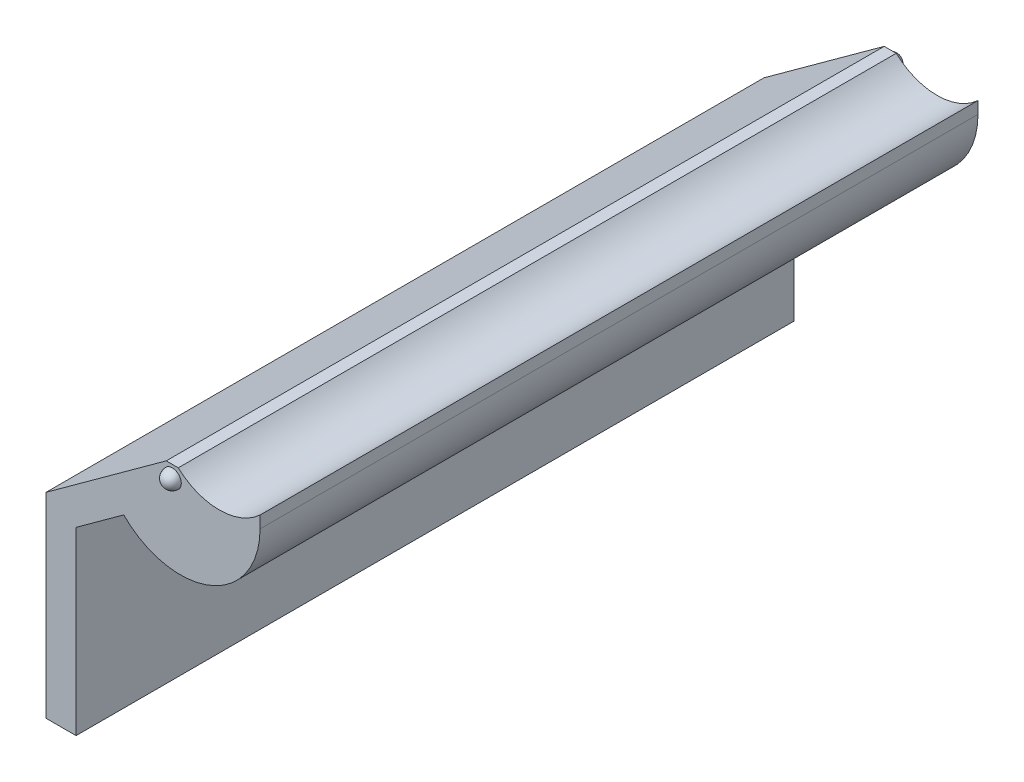
ISO-10303-21;
HEADER;
FILE_DESCRIPTION(('STEP AP214'),'2;1');
FILE_NAME('part.step','',(''),(''),'','','');
FILE_SCHEMA(('AUTOMOTIVE_DESIGN { 1 0 10303 214 1 1 1 1 }'));
ENDSEC;
DATA;
#1=APPLICATION_CONTEXT('core data for automotive mechanical design processes');
#2=APPLICATION_PROTOCOL_DEFINITION('international standard','automotive_design',2000,#1);
#3=PRODUCT_CONTEXT('',#1,'mechanical');
#4=PRODUCT('Part','Part','',(#3));
#5=PRODUCT_RELATED_PRODUCT_CATEGORY('part','',(#4));
#6=PRODUCT_DEFINITION_FORMATION('','',#4);
#7=PRODUCT_DEFINITION_CONTEXT('part definition',#1,'design');
#8=PRODUCT_DEFINITION('design','',#6,#7);
#9=PRODUCT_DEFINITION_SHAPE('','',#8);
#10=(LENGTH_UNIT() NAMED_UNIT(*) SI_UNIT(.MILLI.,.METRE.));
#11=(NAMED_UNIT(*) PLANE_ANGLE_UNIT() SI_UNIT($,.RADIAN.));
#12=(NAMED_UNIT(*) SI_UNIT($,.STERADIAN.) SOLID_ANGLE_UNIT());
#13=UNCERTAINTY_MEASURE_WITH_UNIT(LENGTH_MEASURE(1.E-05),#10,'distance_accuracy_value','');
#14=(GEOMETRIC_REPRESENTATION_CONTEXT(3) GLOBAL_UNCERTAINTY_ASSIGNED_CONTEXT((#13)) GLOBAL_UNIT_ASSIGNED_CONTEXT((#10,
#11,#12)) REPRESENTATION_CONTEXT('',''));
#15=CARTESIAN_POINT('',(0.,0.,0.));
#16=DIRECTION('',(0.,0.,1.));
#17=DIRECTION('',(1.,0.,0.));
#18=AXIS2_PLACEMENT_3D('',#15,#16,#17);
#19=CARTESIAN_POINT('',(-25.4,-38.2321071371408,75.819));
#20=DIRECTION('',(0.587785252292478,-0.809016994374944,0.));
#21=DIRECTION('',(0.809016994374944,0.587785252292478,0.));
#22=AXIS2_PLACEMENT_3D('',#19,#20,#21);
#23=PLANE('',#22);
#24=DIRECTION('',(-0.809016994374944,-0.587785252292478,0.));
#25=VECTOR('',#24,1.);
#26=CARTESIAN_POINT('',(-25.4,-38.2321071371408,-75.819));
#27=LINE('',#26,#25);
#28=CARTESIAN_POINT('',(0.,-19.7779269258044,-75.819));
#29=VERTEX_POINT('',#28);
#30=CARTESIAN_POINT('',(-25.4,-38.2321071371408,-75.819));
#31=VERTEX_POINT('',#30);
#32=EDGE_CURVE('E136',#29,#31,#27,.T.);
#33=ORIENTED_EDGE('',*,*,#32,.T.);
#34=DIRECTION('',(0.,0.,-1.));
#35=VECTOR('',#34,1.);
#36=CARTESIAN_POINT('',(-25.4,-38.2321071371408,75.819));
#37=LINE('',#36,#35);
#38=CARTESIAN_POINT('',(-25.4,-38.2321071371408,75.819));
#39=VERTEX_POINT('',#38);
#40=EDGE_CURVE('E41',#39,#31,#37,.T.);
#41=ORIENTED_EDGE('',*,*,#40,.F.);
#42=DIRECTION('',(-0.809016994374944,-0.587785252292478,0.));
#43=VECTOR('',#42,1.);
#44=CARTESIAN_POINT('',(-25.4,-38.2321071371408,75.819));
#45=LINE('',#44,#43);
#46=CARTESIAN_POINT('',(0.,-19.7779269258044,75.819));
#47=VERTEX_POINT('',#46);
#48=EDGE_CURVE('E153',#47,#39,#45,.T.);
#49=ORIENTED_EDGE('',*,*,#48,.F.);
#50=DIRECTION('',(0.,0.,-1.));
#51=VECTOR('',#50,1.);
#52=CARTESIAN_POINT('',(0.,-19.7779269258044,75.819));
#53=LINE('',#52,#51);
#54=EDGE_CURVE('E132',#47,#29,#53,.T.);
#55=ORIENTED_EDGE('',*,*,#54,.T.);
#56=EDGE_LOOP('',(#33,#41,#49,#55));
#57=FACE_BOUND('',#56,.T.);
#58=ADVANCED_FACE('F33',(#57),#23,.F.);
#59=CARTESIAN_POINT('',(-25.4,-38.2321071371408,75.819));
#60=DIRECTION('',(1.,0.,0.));
#61=DIRECTION('',(0.,1.,0.));
#62=AXIS2_PLACEMENT_3D('',#59,#60,#61);
#63=PLANE('',#62);
#64=DIRECTION('',(0.,-1.,0.));
#65=VECTOR('',#64,1.);
#66=CARTESIAN_POINT('',(-25.4,-38.2321071371408,-75.819));
#67=LINE('',#66,#65);
#68=CARTESIAN_POINT('',(-25.4,-79.5675937414304,-75.819));
#69=VERTEX_POINT('',#68);
#70=EDGE_CURVE('E139',#31,#69,#67,.T.);
#71=ORIENTED_EDGE('',*,*,#70,.T.);
#72=DIRECTION('',(0.,0.,-1.));
#73=VECTOR('',#72,1.);
#74=CARTESIAN_POINT('',(-25.4,-79.5675937414304,75.819));
#75=LINE('',#74,#73);
#76=CARTESIAN_POINT('',(-25.4,-79.5675937414304,75.819));
#77=VERTEX_POINT('',#76);
#78=EDGE_CURVE('E166',#77,#69,#75,.T.);
#79=ORIENTED_EDGE('',*,*,#78,.F.);
#80=DIRECTION('',(0.,-1.,0.));
#81=VECTOR('',#80,1.);
#82=CARTESIAN_POINT('',(-25.4,-38.2321071371408,75.819));
#83=LINE('',#82,#81);
#84=EDGE_CURVE('E96',#39,#77,#83,.T.);
#85=ORIENTED_EDGE('',*,*,#84,.F.);
#86=ORIENTED_EDGE('',*,*,#40,.T.);
#87=EDGE_LOOP('',(#71,#79,#85,#86));
#88=FACE_BOUND('',#87,.T.);
#89=ADVANCED_FACE('F188',(#88),#63,.F.);
#90=CARTESIAN_POINT('',(-25.4,-79.5675937414304,75.819));
#91=DIRECTION('',(0.,1.,0.));
#92=DIRECTION('',(-1.,0.,0.));
#93=AXIS2_PLACEMENT_3D('',#90,#91,#92);
#94=PLANE('',#93);
#95=DIRECTION('',(1.,0.,0.));
#96=VECTOR('',#95,1.);
#97=CARTESIAN_POINT('',(-25.4,-79.5675937414304,-75.819));
#98=LINE('',#97,#96);
#99=CARTESIAN_POINT('',(-19.05,-79.5675937414304,-75.819));
#100=VERTEX_POINT('',#99);
#101=EDGE_CURVE('E142',#69,#100,#98,.T.);
#102=ORIENTED_EDGE('',*,*,#101,.T.);
#103=DIRECTION('',(0.,0.,-1.));
#104=VECTOR('',#103,1.);
#105=CARTESIAN_POINT('',(-19.05,-79.5675937414304,75.819));
#106=LINE('',#105,#104);
#107=CARTESIAN_POINT('',(-19.05,-79.5675937414304,75.819));
#108=VERTEX_POINT('',#107);
#109=EDGE_CURVE('E163',#108,#100,#106,.T.);
#110=ORIENTED_EDGE('',*,*,#109,.F.);
#111=DIRECTION('',(1.,0.,0.));
#112=VECTOR('',#111,1.);
#113=CARTESIAN_POINT('',(-25.4,-79.5675937414304,75.819));
#114=LINE('',#113,#112);
#115=EDGE_CURVE('E203',#77,#108,#114,.T.);
#116=ORIENTED_EDGE('',*,*,#115,.F.);
#117=ORIENTED_EDGE('',*,*,#78,.T.);
#118=EDGE_LOOP('',(#102,#110,#116,#117));
#119=FACE_BOUND('',#118,.T.);
#120=ADVANCED_FACE('F193',(#119),#94,.F.);
#121=CARTESIAN_POINT('',(-19.05,-41.4675937414304,75.819));
#122=DIRECTION('',(-1.,0.,0.));
#123=DIRECTION('',(0.,0.,1.));
#124=AXIS2_PLACEMENT_3D('',#121,#122,#123);
#125=PLANE('',#124);
#126=DIRECTION('',(0.,1.,0.));
#127=VECTOR('',#126,1.);
#128=CARTESIAN_POINT('',(-19.05,-41.4675937414304,-75.819));
#129=LINE('',#128,#127);
#130=CARTESIAN_POINT('',(-19.05,-41.4675937414304,-75.819));
#131=VERTEX_POINT('',#130);
#132=EDGE_CURVE('E144',#100,#131,#129,.T.);
#133=ORIENTED_EDGE('',*,*,#132,.T.);
#134=DIRECTION('',(0.,0.,-1.));
#135=VECTOR('',#134,1.);
#136=CARTESIAN_POINT('',(-19.05,-41.4675937414304,75.819));
#137=LINE('',#136,#135);
#138=CARTESIAN_POINT('',(-19.05,-41.4675937414304,75.819));
#139=VERTEX_POINT('',#138);
#140=EDGE_CURVE('E160',#139,#131,#137,.T.);
#141=ORIENTED_EDGE('',*,*,#140,.F.);
#142=DIRECTION('',(0.,1.,0.));
#143=VECTOR('',#142,1.);
#144=CARTESIAN_POINT('',(-19.05,-41.4675937414304,75.819));
#145=LINE('',#144,#143);
#146=EDGE_CURVE('E205',#108,#139,#145,.T.);
#147=ORIENTED_EDGE('',*,*,#146,.F.);
#148=ORIENTED_EDGE('',*,*,#109,.T.);
#149=EDGE_LOOP('',(#133,#141,#147,#148));
#150=FACE_BOUND('',#149,.T.);
#151=ADVANCED_FACE('F222',(#150),#125,.F.);
#152=CARTESIAN_POINT('',(-19.05,-41.4675937414304,75.819));
#153=DIRECTION('',(-0.587785252292478,0.809016994374944,0.));
#154=DIRECTION('',(-0.809016994374944,-0.587785252292478,0.));
#155=AXIS2_PLACEMENT_3D('',#152,#153,#154);
#156=PLANE('',#155);
#157=DIRECTION('',(0.809016994374944,0.587785252292478,0.));
#158=VECTOR('',#157,1.);
#159=CARTESIAN_POINT('',(-19.05,-41.4675937414304,-75.819));
#160=LINE('',#159,#158);
#161=CARTESIAN_POINT('',(-8.98183746909748,-34.1526454838595,-75.819));
#162=VERTEX_POINT('',#161);
#163=EDGE_CURVE('E146',#131,#162,#160,.T.);
#164=ORIENTED_EDGE('',*,*,#163,.T.);
#165=DIRECTION('',(0.,0.,-1.));
#166=VECTOR('',#165,1.);
#167=CARTESIAN_POINT('',(-8.98183746909748,-34.1526454838595,75.819));
#168=LINE('',#167,#166);
#169=CARTESIAN_POINT('',(-8.98183746909748,-34.1526454838595,75.819));
#170=VERTEX_POINT('',#169);
#171=EDGE_CURVE('E157',#170,#162,#168,.T.);
#172=ORIENTED_EDGE('',*,*,#171,.F.);
#173=DIRECTION('',(0.809016994374944,0.587785252292478,0.));
#174=VECTOR('',#173,1.);
#175=CARTESIAN_POINT('',(-19.05,-41.4675937414304,75.819));
#176=LINE('',#175,#174);
#177=EDGE_CURVE('E207',#139,#170,#176,.T.);
#178=ORIENTED_EDGE('',*,*,#177,.F.);
#179=ORIENTED_EDGE('',*,*,#140,.T.);
#180=EDGE_LOOP('',(#164,#172,#178,#179));
#181=FACE_BOUND('',#180,.T.);
#182=ADVANCED_FACE('F216',(#181),#156,.F.);
#183=CARTESIAN_POINT('',(2.98295384411167,-22.3179269258044,75.819));
#184=DIRECTION('',(0.,0.,-1.));
#185=DIRECTION('',(-1.,0.,0.));
#186=AXIS2_PLACEMENT_3D('',#183,#184,#185);
#187=CYLINDRICAL_SURFACE('',#186,16.8290461558883);
#188=CARTESIAN_POINT('',(2.98295384411167,-22.3179269258044,-75.819));
#189=DIRECTION('',(0.,0.,1.));
#190=DIRECTION('',(1.,0.,0.));
#191=AXIS2_PLACEMENT_3D('',#188,#189,#190);
#192=CIRCLE('',#191,16.8290461558883);
#193=CARTESIAN_POINT('',(19.812,-22.3179269258044,-75.819));
#194=VERTEX_POINT('',#193);
#195=EDGE_CURVE('E148',#162,#194,#192,.T.);
#196=ORIENTED_EDGE('',*,*,#195,.T.);
#197=DIRECTION('',(0.,0.,-1.));
#198=VECTOR('',#197,1.);
#199=CARTESIAN_POINT('',(19.812,-22.3179269258044,75.819));
#200=LINE('',#199,#198);
#201=CARTESIAN_POINT('',(19.812,-22.3179269258044,75.819));
#202=VERTEX_POINT('',#201);
#203=EDGE_CURVE('E127',#202,#194,#200,.T.);
#204=ORIENTED_EDGE('',*,*,#203,.F.);
#205=CARTESIAN_POINT('',(2.98295384411167,-22.3179269258044,75.819));
#206=DIRECTION('',(0.,0.,1.));
#207=DIRECTION('',(1.,0.,0.));
#208=AXIS2_PLACEMENT_3D('',#205,#206,#207);
#209=CIRCLE('',#208,16.8290461558883);
#210=EDGE_CURVE('E118',#170,#202,#209,.T.);
#211=ORIENTED_EDGE('',*,*,#210,.F.);
#212=ORIENTED_EDGE('',*,*,#171,.T.);
#213=EDGE_LOOP('',(#196,#204,#211,#212));
#214=FACE_BOUND('',#213,.T.);
#215=ADVANCED_FACE('F220',(#214),#187,.T.);
#216=CARTESIAN_POINT('',(19.812,-19.7779269258044,75.819));
#217=DIRECTION('',(-1.,0.,0.));
#218=DIRECTION('',(0.,-1.,0.));
#219=AXIS2_PLACEMENT_3D('',#216,#217,#218);
#220=PLANE('',#219);
#221=DIRECTION('',(0.,1.,0.));
#222=VECTOR('',#221,1.);
#223=CARTESIAN_POINT('',(19.812,-19.7779269258044,-75.819));
#224=LINE('',#223,#222);
#225=CARTESIAN_POINT('',(19.812,-19.7779269258044,-75.819));
#226=VERTEX_POINT('',#225);
#227=EDGE_CURVE('E126',#194,#226,#224,.T.);
#228=ORIENTED_EDGE('',*,*,#227,.T.);
#229=DIRECTION('',(0.,0.,-1.));
#230=VECTOR('',#229,1.);
#231=CARTESIAN_POINT('',(19.812,-19.7779269258044,75.819));
#232=LINE('',#231,#230);
#233=CARTESIAN_POINT('',(19.812,-19.7779269258044,75.819));
#234=VERTEX_POINT('',#233);
#235=EDGE_CURVE('E123',#234,#226,#232,.T.);
#236=ORIENTED_EDGE('',*,*,#235,.F.);
#237=DIRECTION('',(0.,1.,0.));
#238=VECTOR('',#237,1.);
#239=CARTESIAN_POINT('',(19.812,-19.7779269258044,75.819));
#240=LINE('',#239,#238);
#241=EDGE_CURVE('E112',#202,#234,#240,.T.);
#242=ORIENTED_EDGE('',*,*,#241,.F.);
#243=ORIENTED_EDGE('',*,*,#203,.T.);
#244=EDGE_LOOP('',(#228,#236,#242,#243));
#245=FACE_BOUND('',#244,.T.);
#246=ADVANCED_FACE('F124',(#245),#220,.F.);
#247=CARTESIAN_POINT('',(11.176,-10.4661331136541,75.819));
#248=DIRECTION('',(0.,0.,-1.));
#249=DIRECTION('',(-1.,0.,0.));
#250=AXIS2_PLACEMENT_3D('',#247,#248,#249);
#251=CYLINDRICAL_SURFACE('',#250,12.7);
#252=CARTESIAN_POINT('',(11.176,-10.4661331136541,-75.819));
#253=DIRECTION('',(0.,0.,-1.));
#254=DIRECTION('',(1.,0.,0.));
#255=AXIS2_PLACEMENT_3D('',#252,#253,#254);
#256=CIRCLE('',#255,12.7);
#257=CARTESIAN_POINT('',(2.54,-19.7779269258044,-75.819));
#258=VERTEX_POINT('',#257);
#259=EDGE_CURVE('E81',#226,#258,#256,.T.);
#260=ORIENTED_EDGE('',*,*,#259,.T.);
#261=DIRECTION('',(0.,0.,-1.));
#262=VECTOR('',#261,1.);
#263=CARTESIAN_POINT('',(2.54,-19.7779269258044,75.819));
#264=LINE('',#263,#262);
#265=CARTESIAN_POINT('',(2.54,-19.7779269258044,75.819));
#266=VERTEX_POINT('',#265);
#267=EDGE_CURVE('E128',#266,#258,#264,.T.);
#268=ORIENTED_EDGE('',*,*,#267,.F.);
#269=CARTESIAN_POINT('',(11.176,-10.4661331136541,75.819));
#270=DIRECTION('',(0.,0.,-1.));
#271=DIRECTION('',(1.,0.,0.));
#272=AXIS2_PLACEMENT_3D('',#269,#270,#271);
#273=CIRCLE('',#272,12.7);
#274=EDGE_CURVE('E116',#234,#266,#273,.T.);
#275=ORIENTED_EDGE('',*,*,#274,.F.);
#276=ORIENTED_EDGE('',*,*,#235,.T.);
#277=EDGE_LOOP('',(#260,#268,#275,#276));
#278=FACE_BOUND('',#277,.T.);
#279=ADVANCED_FACE('F130',(#278),#251,.F.);
#280=CARTESIAN_POINT('',(0.,-19.7779269258044,75.819));
#281=DIRECTION('',(0.,-1.,0.));
#282=DIRECTION('',(0.,0.,-1.));
#283=AXIS2_PLACEMENT_3D('',#280,#281,#282);
#284=PLANE('',#283);
#285=DIRECTION('',(-1.,0.,0.));
#286=VECTOR('',#285,1.);
#287=CARTESIAN_POINT('',(0.,-19.7779269258044,-75.819));
#288=LINE('',#287,#286);
#289=EDGE_CURVE('E87',#258,#29,#288,.T.);
#290=ORIENTED_EDGE('',*,*,#289,.T.);
#291=ORIENTED_EDGE('',*,*,#54,.F.);
#292=DIRECTION('',(-1.,0.,0.));
#293=VECTOR('',#292,1.);
#294=CARTESIAN_POINT('',(0.,-19.7779269258044,75.819));
#295=LINE('',#294,#293);
#296=EDGE_CURVE('E49',#266,#47,#295,.T.);
#297=ORIENTED_EDGE('',*,*,#296,.F.);
#298=ORIENTED_EDGE('',*,*,#267,.T.);
#299=EDGE_LOOP('',(#290,#291,#297,#298));
#300=FACE_BOUND('',#299,.T.);
#301=ADVANCED_FACE('F238',(#300),#284,.F.);
#302=CARTESIAN_POINT('',(11.176,-10.4661331136541,75.819));
#303=DIRECTION('',(0.,0.,1.));
#304=DIRECTION('',(1.,0.,0.));
#305=AXIS2_PLACEMENT_3D('',#302,#303,#304);
#306=PLANE('',#305);
#307=CARTESIAN_POINT('',(1.27,-22.3179269258044,75.819));
#308=DIRECTION('',(0.,0.,1.));
#309=DIRECTION('',(1.,0.,0.));
#310=AXIS2_PLACEMENT_3D('',#307,#308,#309);
#311=CIRCLE('',#310,1.905);
#312=CARTESIAN_POINT('',(3.175,-22.3179269258044,75.819));
#313=VERTEX_POINT('',#312);
#314=EDGE_CURVE('E140',#313,#313,#311,.F.);
#315=ORIENTED_EDGE('',*,*,#314,.T.);
#316=EDGE_LOOP('',(#315));
#317=FACE_BOUND('',#316,.T.);
#318=ORIENTED_EDGE('',*,*,#48,.T.);
#319=ORIENTED_EDGE('',*,*,#84,.T.);
#320=ORIENTED_EDGE('',*,*,#115,.T.);
#321=ORIENTED_EDGE('',*,*,#146,.T.);
#322=ORIENTED_EDGE('',*,*,#177,.T.);
#323=ORIENTED_EDGE('',*,*,#210,.T.);
#324=ORIENTED_EDGE('',*,*,#241,.T.);
#325=ORIENTED_EDGE('',*,*,#274,.T.);
#326=ORIENTED_EDGE('',*,*,#296,.T.);
#327=EDGE_LOOP('',(#318,#319,#320,#321,#322,#323,#324,#325,#326));
#328=FACE_BOUND('',#327,.T.);
#329=ADVANCED_FACE('F114',(#317,#328),#306,.T.);
#330=CARTESIAN_POINT('',(11.176,-10.4661331136541,-75.819));
#331=DIRECTION('',(0.,0.,1.));
#332=DIRECTION('',(1.,0.,0.));
#333=AXIS2_PLACEMENT_3D('',#330,#331,#332);
#334=PLANE('',#333);
#335=CARTESIAN_POINT('',(1.27,-22.3179269258044,-75.819));
#336=DIRECTION('',(0.,0.,1.));
#337=DIRECTION('',(1.,0.,0.));
#338=AXIS2_PLACEMENT_3D('',#335,#336,#337);
#339=CIRCLE('',#338,1.905);
#340=CARTESIAN_POINT('',(3.175,-22.3179269258044,-75.819));
#341=VERTEX_POINT('',#340);
#342=EDGE_CURVE('E11',#341,#341,#339,.F.);
#343=ORIENTED_EDGE('',*,*,#342,.F.);
#344=EDGE_LOOP('',(#343));
#345=FACE_BOUND('',#344,.T.);
#346=ORIENTED_EDGE('',*,*,#32,.F.);
#347=ORIENTED_EDGE('',*,*,#289,.F.);
#348=ORIENTED_EDGE('',*,*,#259,.F.);
#349=ORIENTED_EDGE('',*,*,#227,.F.);
#350=ORIENTED_EDGE('',*,*,#195,.F.);
#351=ORIENTED_EDGE('',*,*,#163,.F.);
#352=ORIENTED_EDGE('',*,*,#132,.F.);
#353=ORIENTED_EDGE('',*,*,#101,.F.);
#354=ORIENTED_EDGE('',*,*,#70,.F.);
#355=EDGE_LOOP('',(#346,#347,#348,#349,#350,#351,#352,#353,#354));
#356=FACE_BOUND('',#355,.T.);
#357=ADVANCED_FACE('F176',(#345,#356),#334,.F.);
#358=CARTESIAN_POINT('',(1.27,-22.3179269258044,75.819));
#359=DIRECTION('',(0.,1.,0.));
#360=DIRECTION('',(-1.,0.,0.));
#361=AXIS2_PLACEMENT_3D('',#358,#359,#360);
#362=SPHERICAL_SURFACE('',#361,1.905);
#363=CARTESIAN_POINT('',(1.27,-22.3179269258044,75.819));
#364=DIRECTION('',(0.,0.,1.));
#365=DIRECTION('',(1.,0.,0.));
#366=AXIS2_PLACEMENT_3D('',#363,#364,#365);
#367=SPHERICAL_SURFACE('',#366,1.905);
#368=ORIENTED_EDGE('',*,*,#314,.F.);
#369=EDGE_LOOP('',(#368));
#370=FACE_BOUND('',#369,.T.);
#371=ADVANCED_FACE('F173',(#370),#367,.T.);
#372=CARTESIAN_POINT('',(1.27,-22.3179269258044,-75.819));
#373=DIRECTION('',(0.,1.,0.));
#374=DIRECTION('',(-1.,0.,0.));
#375=AXIS2_PLACEMENT_3D('',#372,#373,#374);
#376=SPHERICAL_SURFACE('',#375,1.905);
#377=CARTESIAN_POINT('',(1.27,-22.3179269258044,-75.819));
#378=DIRECTION('',(0.,0.,1.));
#379=DIRECTION('',(1.,0.,0.));
#380=AXIS2_PLACEMENT_3D('',#377,#378,#379);
#381=SPHERICAL_SURFACE('',#380,1.905);
#382=ORIENTED_EDGE('',*,*,#342,.T.);
#383=EDGE_LOOP('',(#382));
#384=FACE_BOUND('',#383,.T.);
#385=ADVANCED_FACE('F175',(#384),#381,.T.);
#386=CLOSED_SHELL('',(#58,#89,#120,#151,#182,#215,#246,#279,#301,#329,#357,#371,#385));
#387=MANIFOLD_SOLID_BREP('B2',#386);
#388=ADVANCED_BREP_SHAPE_REPRESENTATION('',(#18,#387),#14);
#389=SHAPE_DEFINITION_REPRESENTATION(#9,#388);
ENDSEC;
END-ISO-10303-21;
